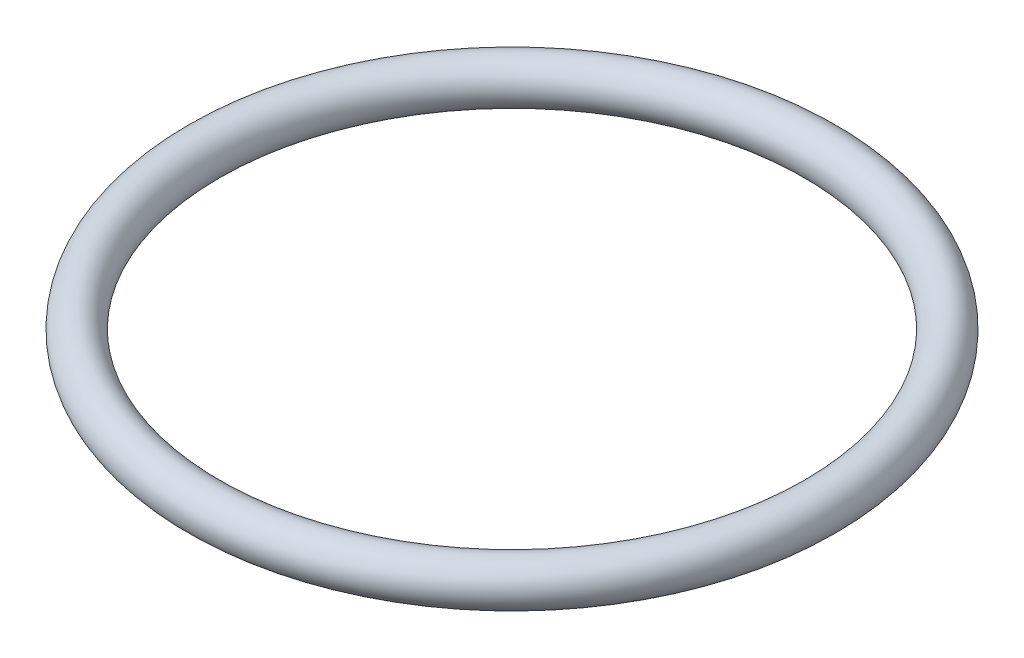
ISO-10303-21;
HEADER;
FILE_DESCRIPTION(('STEP AP214'),'2;1');
FILE_NAME('part.step','',(''),(''),'','','');
FILE_SCHEMA(('AUTOMOTIVE_DESIGN { 1 0 10303 214 1 1 1 1 }'));
ENDSEC;
DATA;
#1=APPLICATION_CONTEXT('core data for automotive mechanical design processes');
#2=APPLICATION_PROTOCOL_DEFINITION('international standard','automotive_design',2000,#1);
#3=PRODUCT_CONTEXT('',#1,'mechanical');
#4=PRODUCT('Part','Part','',(#3));
#5=PRODUCT_RELATED_PRODUCT_CATEGORY('part','',(#4));
#6=PRODUCT_DEFINITION_FORMATION('','',#4);
#7=PRODUCT_DEFINITION_CONTEXT('part definition',#1,'design');
#8=PRODUCT_DEFINITION('design','',#6,#7);
#9=PRODUCT_DEFINITION_SHAPE('','',#8);
#10=(LENGTH_UNIT() NAMED_UNIT(*) SI_UNIT(.MILLI.,.METRE.));
#11=(NAMED_UNIT(*) PLANE_ANGLE_UNIT() SI_UNIT($,.RADIAN.));
#12=(NAMED_UNIT(*) SI_UNIT($,.STERADIAN.) SOLID_ANGLE_UNIT());
#13=UNCERTAINTY_MEASURE_WITH_UNIT(LENGTH_MEASURE(1.E-05),#10,'distance_accuracy_value','');
#14=(GEOMETRIC_REPRESENTATION_CONTEXT(3) GLOBAL_UNCERTAINTY_ASSIGNED_CONTEXT((#13)) GLOBAL_UNIT_ASSIGNED_CONTEXT((#10,
#11,#12)) REPRESENTATION_CONTEXT('',''));
#15=CARTESIAN_POINT('',(0.,0.,0.));
#16=DIRECTION('',(0.,0.,1.));
#17=DIRECTION('',(1.,0.,0.));
#18=AXIS2_PLACEMENT_3D('',#15,#16,#17);
#19=CARTESIAN_POINT('',(0.,0.,0.));
#20=DIRECTION('',(0.,1.,0.));
#21=DIRECTION('',(-1.,0.,0.));
#22=AXIS2_PLACEMENT_3D('',#19,#20,#21);
#23=TOROIDAL_SURFACE('',#22,12.87145,0.90805);
#24=CARTESIAN_POINT('',(-13.7795,0.,0.));
#25=VERTEX_POINT('',#24);
#26=VERTEX_LOOP('',#25);
#27=FACE_BOUND('',#26,.T.);
#28=ADVANCED_FACE('F30',(#27),#23,.T.);
#29=CLOSED_SHELL('',(#28));
#30=MANIFOLD_SOLID_BREP('B2',#29);
#31=ADVANCED_BREP_SHAPE_REPRESENTATION('',(#18,#30),#14);
#32=SHAPE_DEFINITION_REPRESENTATION(#9,#31);
ENDSEC;
END-ISO-10303-21;
